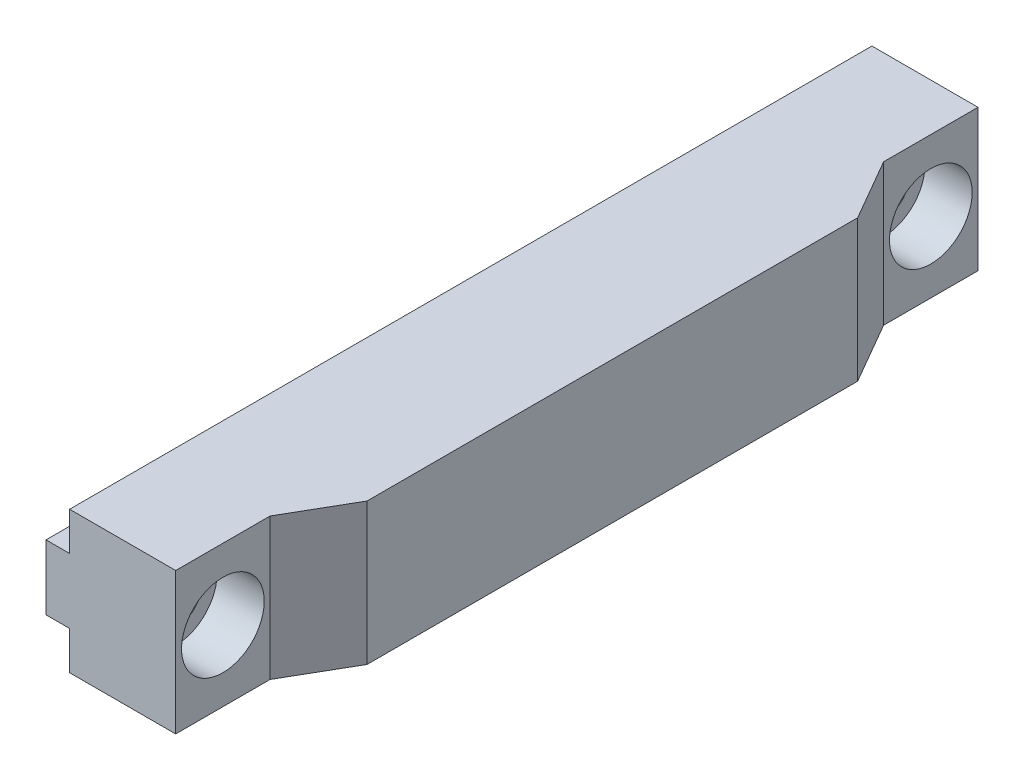
ISO-10303-21;
HEADER;
FILE_DESCRIPTION(('STEP AP214'),'2;1');
FILE_NAME('part.step','',(''),(''),'','','');
FILE_SCHEMA(('AUTOMOTIVE_DESIGN { 1 0 10303 214 1 1 1 1 }'));
ENDSEC;
DATA;
#1=APPLICATION_CONTEXT('core data for automotive mechanical design processes');
#2=APPLICATION_PROTOCOL_DEFINITION('international standard','automotive_design',2000,#1);
#3=PRODUCT_CONTEXT('',#1,'mechanical');
#4=PRODUCT('Part','Part','',(#3));
#5=PRODUCT_RELATED_PRODUCT_CATEGORY('part','',(#4));
#6=PRODUCT_DEFINITION_FORMATION('','',#4);
#7=PRODUCT_DEFINITION_CONTEXT('part definition',#1,'design');
#8=PRODUCT_DEFINITION('design','',#6,#7);
#9=PRODUCT_DEFINITION_SHAPE('','',#8);
#10=(LENGTH_UNIT() NAMED_UNIT(*) SI_UNIT(.MILLI.,.METRE.));
#11=(NAMED_UNIT(*) PLANE_ANGLE_UNIT() SI_UNIT($,.RADIAN.));
#12=(NAMED_UNIT(*) SI_UNIT($,.STERADIAN.) SOLID_ANGLE_UNIT());
#13=UNCERTAINTY_MEASURE_WITH_UNIT(LENGTH_MEASURE(1.E-05),#10,'distance_accuracy_value','');
#14=(GEOMETRIC_REPRESENTATION_CONTEXT(3) GLOBAL_UNCERTAINTY_ASSIGNED_CONTEXT((#13)) GLOBAL_UNIT_ASSIGNED_CONTEXT((#10,
#11,#12)) REPRESENTATION_CONTEXT('',''));
#15=CARTESIAN_POINT('',(0.,0.,0.));
#16=DIRECTION('',(0.,0.,1.));
#17=DIRECTION('',(1.,0.,0.));
#18=AXIS2_PLACEMENT_3D('',#15,#16,#17);
#19=CARTESIAN_POINT('',(-17.4752,0.,-47.625));
#20=DIRECTION('',(1.,0.,0.));
#21=DIRECTION('',(0.,0.,-1.));
#22=AXIS2_PLACEMENT_3D('',#19,#20,#21);
#23=CYLINDRICAL_SURFACE('',#22,3.5687);
#24=CARTESIAN_POINT('',(-12.7,0.,-47.625));
#25=DIRECTION('',(-1.,0.,0.));
#26=DIRECTION('',(0.,0.,1.));
#27=AXIS2_PLACEMENT_3D('',#24,#25,#26);
#28=CIRCLE('',#27,3.5687);
#29=CARTESIAN_POINT('',(-12.7,0.,-44.0563));
#30=VERTEX_POINT('',#29);
#31=EDGE_CURVE('E186',#30,#30,#28,.T.);
#32=ORIENTED_EDGE('',*,*,#31,.T.);
#33=EDGE_LOOP('',(#32));
#34=FACE_BOUND('',#33,.T.);
#35=CARTESIAN_POINT('',(-1.6002,0.,-47.625));
#36=DIRECTION('',(1.,0.,0.));
#37=DIRECTION('',(0.,0.,-1.));
#38=AXIS2_PLACEMENT_3D('',#35,#36,#37);
#39=CIRCLE('',#38,3.5687);
#40=CARTESIAN_POINT('',(-1.6002,0.,-51.1937));
#41=VERTEX_POINT('',#40);
#42=EDGE_CURVE('E45',#41,#41,#39,.F.);
#43=ORIENTED_EDGE('',*,*,#42,.F.);
#44=EDGE_LOOP('',(#43));
#45=FACE_BOUND('',#44,.T.);
#46=ADVANCED_FACE('F41',(#34,#45),#23,.F.);
#47=CARTESIAN_POINT('',(-17.4752,0.,47.625));
#48=DIRECTION('',(1.,0.,0.));
#49=DIRECTION('',(0.,0.,-1.));
#50=AXIS2_PLACEMENT_3D('',#47,#48,#49);
#51=CYLINDRICAL_SURFACE('',#50,3.5687);
#52=CARTESIAN_POINT('',(-12.7,0.,47.625));
#53=DIRECTION('',(-1.,0.,0.));
#54=DIRECTION('',(0.,0.,1.));
#55=AXIS2_PLACEMENT_3D('',#52,#53,#54);
#56=CIRCLE('',#55,3.5687);
#57=CARTESIAN_POINT('',(-12.7,0.,51.1937));
#58=VERTEX_POINT('',#57);
#59=EDGE_CURVE('E189',#58,#58,#56,.T.);
#60=ORIENTED_EDGE('',*,*,#59,.T.);
#61=EDGE_LOOP('',(#60));
#62=FACE_BOUND('',#61,.T.);
#63=CARTESIAN_POINT('',(-1.6002,0.,47.625));
#64=DIRECTION('',(1.,0.,0.));
#65=DIRECTION('',(0.,0.,-1.));
#66=AXIS2_PLACEMENT_3D('',#63,#64,#65);
#67=CIRCLE('',#66,3.5687);
#68=CARTESIAN_POINT('',(-1.6002,0.,44.0563));
#69=VERTEX_POINT('',#68);
#70=EDGE_CURVE('E192',#69,#69,#67,.F.);
#71=ORIENTED_EDGE('',*,*,#70,.F.);
#72=EDGE_LOOP('',(#71));
#73=FACE_BOUND('',#72,.T.);
#74=ADVANCED_FACE('F294',(#62,#73),#51,.F.);
#75=CARTESIAN_POINT('',(-9.525,9.525,53.975));
#76=DIRECTION('',(1.,0.,0.));
#77=DIRECTION('',(0.,0.,-1.));
#78=AXIS2_PLACEMENT_3D('',#75,#76,#77);
#79=PLANE('',#78);
#80=DIRECTION('',(0.,-1.,0.));
#81=VECTOR('',#80,1.);
#82=CARTESIAN_POINT('',(-9.525,9.525,-53.975));
#83=LINE('',#82,#81);
#84=CARTESIAN_POINT('',(-9.525,9.525,-53.975));
#85=VERTEX_POINT('',#84);
#86=CARTESIAN_POINT('',(-9.525,4.3688,-53.975));
#87=VERTEX_POINT('',#86);
#88=EDGE_CURVE('E146',#85,#87,#83,.T.);
#89=ORIENTED_EDGE('',*,*,#88,.T.);
#90=DIRECTION('',(0.,0.,1.));
#91=VECTOR('',#90,1.);
#92=CARTESIAN_POINT('',(-9.525,4.3688,53.975));
#93=LINE('',#92,#91);
#94=CARTESIAN_POINT('',(-9.525,4.3688,53.975));
#95=VERTEX_POINT('',#94);
#96=EDGE_CURVE('E212',#87,#95,#93,.T.);
#97=ORIENTED_EDGE('',*,*,#96,.T.);
#98=DIRECTION('',(0.,-1.,0.));
#99=VECTOR('',#98,1.);
#100=CARTESIAN_POINT('',(-9.525,9.525,53.975));
#101=LINE('',#100,#99);
#102=CARTESIAN_POINT('',(-9.525,9.525,53.975));
#103=VERTEX_POINT('',#102);
#104=EDGE_CURVE('E172',#103,#95,#101,.T.);
#105=ORIENTED_EDGE('',*,*,#104,.F.);
#106=DIRECTION('',(0.,0.,1.));
#107=VECTOR('',#106,1.);
#108=CARTESIAN_POINT('',(-9.525,9.525,53.975));
#109=LINE('',#108,#107);
#110=EDGE_CURVE('E67',#85,#103,#109,.T.);
#111=ORIENTED_EDGE('',*,*,#110,.F.);
#112=EDGE_LOOP('',(#89,#97,#105,#111));
#113=FACE_BOUND('',#112,.T.);
#114=ADVANCED_FACE('F278',(#113),#79,.F.);
#115=CARTESIAN_POINT('',(4.7498,9.525,53.975));
#116=DIRECTION('',(0.,0.,-1.));
#117=DIRECTION('',(-1.,0.,0.));
#118=AXIS2_PLACEMENT_3D('',#115,#116,#117);
#119=PLANE('',#118);
#120=DIRECTION('',(1.,0.,0.));
#121=VECTOR('',#120,1.);
#122=CARTESIAN_POINT('',(4.7498,-9.525,53.975));
#123=LINE('',#122,#121);
#124=CARTESIAN_POINT('',(-9.525,-9.525,53.975));
#125=VERTEX_POINT('',#124);
#126=CARTESIAN_POINT('',(4.7498,-9.525,53.975));
#127=VERTEX_POINT('',#126);
#128=EDGE_CURVE('E155',#125,#127,#123,.T.);
#129=ORIENTED_EDGE('',*,*,#128,.T.);
#130=DIRECTION('',(0.,-1.,0.));
#131=VECTOR('',#130,1.);
#132=CARTESIAN_POINT('',(4.7498,9.525,53.975));
#133=LINE('',#132,#131);
#134=CARTESIAN_POINT('',(4.7498,9.525,53.975));
#135=VERTEX_POINT('',#134);
#136=EDGE_CURVE('E11',#135,#127,#133,.T.);
#137=ORIENTED_EDGE('',*,*,#136,.F.);
#138=DIRECTION('',(1.,0.,0.));
#139=VECTOR('',#138,1.);
#140=CARTESIAN_POINT('',(4.7498,9.525,53.975));
#141=LINE('',#140,#139);
#142=EDGE_CURVE('E171',#103,#135,#141,.T.);
#143=ORIENTED_EDGE('',*,*,#142,.F.);
#144=ORIENTED_EDGE('',*,*,#104,.T.);
#145=DIRECTION('',(-1.,0.,0.));
#146=VECTOR('',#145,1.);
#147=CARTESIAN_POINT('',(-9.525,4.3688,53.975));
#148=LINE('',#147,#146);
#149=CARTESIAN_POINT('',(-12.7,4.3688,53.975));
#150=VERTEX_POINT('',#149);
#151=EDGE_CURVE('E231',#95,#150,#148,.T.);
#152=ORIENTED_EDGE('',*,*,#151,.T.);
#153=DIRECTION('',(0.,-1.,0.));
#154=VECTOR('',#153,1.);
#155=CARTESIAN_POINT('',(-12.7,-4.3688,53.975));
#156=LINE('',#155,#154);
#157=CARTESIAN_POINT('',(-12.7,-4.3688,53.975));
#158=VERTEX_POINT('',#157);
#159=EDGE_CURVE('E223',#150,#158,#156,.T.);
#160=ORIENTED_EDGE('',*,*,#159,.T.);
#161=DIRECTION('',(-1.,0.,0.));
#162=VECTOR('',#161,1.);
#163=CARTESIAN_POINT('',(-9.525,-4.3688,53.975));
#164=LINE('',#163,#162);
#165=CARTESIAN_POINT('',(-9.525,-4.3688,53.975));
#166=VERTEX_POINT('',#165);
#167=EDGE_CURVE('E228',#166,#158,#164,.T.);
#168=ORIENTED_EDGE('',*,*,#167,.F.);
#169=EDGE_CURVE('E101',#166,#125,#101,.T.);
#170=ORIENTED_EDGE('',*,*,#169,.T.);
#171=EDGE_LOOP('',(#129,#137,#143,#144,#152,#160,#168,#170));
#172=FACE_BOUND('',#171,.T.);
#173=ADVANCED_FACE('F43',(#172),#119,.F.);
#174=CARTESIAN_POINT('',(4.7498,9.525,41.275));
#175=DIRECTION('',(-1.,0.,0.));
#176=DIRECTION('',(0.,0.,1.));
#177=AXIS2_PLACEMENT_3D('',#174,#175,#176);
#178=PLANE('',#177);
#179=CARTESIAN_POINT('',(4.7498,0.,47.625));
#180=DIRECTION('',(1.,0.,0.));
#181=DIRECTION('',(0.,0.,-1.));
#182=AXIS2_PLACEMENT_3D('',#179,#180,#181);
#183=CIRCLE('',#182,5.5626);
#184=CARTESIAN_POINT('',(4.7498,0.,42.0624));
#185=VERTEX_POINT('',#184);
#186=EDGE_CURVE('E199',#185,#185,#183,.T.);
#187=ORIENTED_EDGE('',*,*,#186,.F.);
#188=EDGE_LOOP('',(#187));
#189=FACE_BOUND('',#188,.T.);
#190=DIRECTION('',(0.,0.,-1.));
#191=VECTOR('',#190,1.);
#192=CARTESIAN_POINT('',(4.7498,-9.525,41.275));
#193=LINE('',#192,#191);
#194=CARTESIAN_POINT('',(4.7498,-9.525,41.275));
#195=VERTEX_POINT('',#194);
#196=EDGE_CURVE('E157',#127,#195,#193,.T.);
#197=ORIENTED_EDGE('',*,*,#196,.T.);
#198=DIRECTION('',(0.,-1.,0.));
#199=VECTOR('',#198,1.);
#200=CARTESIAN_POINT('',(4.7498,9.525,41.275));
#201=LINE('',#200,#199);
#202=CARTESIAN_POINT('',(4.7498,9.525,41.275));
#203=VERTEX_POINT('',#202);
#204=EDGE_CURVE('E50',#203,#195,#201,.T.);
#205=ORIENTED_EDGE('',*,*,#204,.F.);
#206=DIRECTION('',(0.,0.,-1.));
#207=VECTOR('',#206,1.);
#208=CARTESIAN_POINT('',(4.7498,9.525,41.275));
#209=LINE('',#208,#207);
#210=EDGE_CURVE('E109',#135,#203,#209,.T.);
#211=ORIENTED_EDGE('',*,*,#210,.F.);
#212=ORIENTED_EDGE('',*,*,#136,.T.);
#213=EDGE_LOOP('',(#197,#205,#211,#212));
#214=FACE_BOUND('',#213,.T.);
#215=ADVANCED_FACE('F281',(#189,#214),#178,.F.);
#216=CARTESIAN_POINT('',(9.525,9.525,33.0041109836971));
#217=DIRECTION('',(-0.866025403784439,0.,-0.5));
#218=DIRECTION('',(-0.5,0.,0.866025403784439));
#219=AXIS2_PLACEMENT_3D('',#216,#217,#218);
#220=PLANE('',#219);
#221=DIRECTION('',(0.5,0.,-0.866025403784439));
#222=VECTOR('',#221,1.);
#223=CARTESIAN_POINT('',(9.525,-9.525,33.0041109836971));
#224=LINE('',#223,#222);
#225=CARTESIAN_POINT('',(9.525,-9.525,33.0041109836971));
#226=VERTEX_POINT('',#225);
#227=EDGE_CURVE('E160',#195,#226,#224,.T.);
#228=ORIENTED_EDGE('',*,*,#227,.T.);
#229=DIRECTION('',(0.,-1.,0.));
#230=VECTOR('',#229,1.);
#231=CARTESIAN_POINT('',(9.525,9.525,33.0041109836971));
#232=LINE('',#231,#230);
#233=CARTESIAN_POINT('',(9.525,9.525,33.0041109836971));
#234=VERTEX_POINT('',#233);
#235=EDGE_CURVE('E181',#234,#226,#232,.T.);
#236=ORIENTED_EDGE('',*,*,#235,.F.);
#237=DIRECTION('',(0.5,0.,-0.866025403784439));
#238=VECTOR('',#237,1.);
#239=CARTESIAN_POINT('',(9.525,9.525,33.0041109836971));
#240=LINE('',#239,#238);
#241=EDGE_CURVE('E238',#203,#234,#240,.T.);
#242=ORIENTED_EDGE('',*,*,#241,.F.);
#243=ORIENTED_EDGE('',*,*,#204,.T.);
#244=EDGE_LOOP('',(#228,#236,#242,#243));
#245=FACE_BOUND('',#244,.T.);
#246=ADVANCED_FACE('F284',(#245),#220,.F.);
#247=CARTESIAN_POINT('',(9.525,9.525,-33.0041109836971));
#248=DIRECTION('',(-1.,0.,0.));
#249=DIRECTION('',(0.,0.,1.));
#250=AXIS2_PLACEMENT_3D('',#247,#248,#249);
#251=PLANE('',#250);
#252=DIRECTION('',(0.,0.,-1.));
#253=VECTOR('',#252,1.);
#254=CARTESIAN_POINT('',(9.525,-9.525,-33.0041109836971));
#255=LINE('',#254,#253);
#256=CARTESIAN_POINT('',(9.525,-9.525,-33.0041109836971));
#257=VERTEX_POINT('',#256);
#258=EDGE_CURVE('E162',#226,#257,#255,.T.);
#259=ORIENTED_EDGE('',*,*,#258,.T.);
#260=DIRECTION('',(0.,-1.,0.));
#261=VECTOR('',#260,1.);
#262=CARTESIAN_POINT('',(9.525,9.525,-33.0041109836971));
#263=LINE('',#262,#261);
#264=CARTESIAN_POINT('',(9.525,9.525,-33.0041109836971));
#265=VERTEX_POINT('',#264);
#266=EDGE_CURVE('E178',#265,#257,#263,.T.);
#267=ORIENTED_EDGE('',*,*,#266,.F.);
#268=DIRECTION('',(0.,0.,-1.));
#269=VECTOR('',#268,1.);
#270=CARTESIAN_POINT('',(9.525,9.525,-33.0041109836971));
#271=LINE('',#270,#269);
#272=EDGE_CURVE('E240',#234,#265,#271,.T.);
#273=ORIENTED_EDGE('',*,*,#272,.F.);
#274=ORIENTED_EDGE('',*,*,#235,.T.);
#275=EDGE_LOOP('',(#259,#267,#273,#274));
#276=FACE_BOUND('',#275,.T.);
#277=ADVANCED_FACE('F246',(#276),#251,.F.);
#278=CARTESIAN_POINT('',(4.7498,9.525,-41.275));
#279=DIRECTION('',(-0.866025403784439,0.,0.5));
#280=DIRECTION('',(0.5,0.,0.866025403784439));
#281=AXIS2_PLACEMENT_3D('',#278,#279,#280);
#282=PLANE('',#281);
#283=DIRECTION('',(-0.5,0.,-0.866025403784439));
#284=VECTOR('',#283,1.);
#285=CARTESIAN_POINT('',(4.7498,-9.525,-41.275));
#286=LINE('',#285,#284);
#287=CARTESIAN_POINT('',(4.7498,-9.525,-41.275));
#288=VERTEX_POINT('',#287);
#289=EDGE_CURVE('E164',#257,#288,#286,.T.);
#290=ORIENTED_EDGE('',*,*,#289,.T.);
#291=DIRECTION('',(0.,-1.,0.));
#292=VECTOR('',#291,1.);
#293=CARTESIAN_POINT('',(4.7498,9.525,-41.275));
#294=LINE('',#293,#292);
#295=CARTESIAN_POINT('',(4.7498,9.525,-41.275));
#296=VERTEX_POINT('',#295);
#297=EDGE_CURVE('E145',#296,#288,#294,.T.);
#298=ORIENTED_EDGE('',*,*,#297,.F.);
#299=DIRECTION('',(-0.5,0.,-0.866025403784439));
#300=VECTOR('',#299,1.);
#301=CARTESIAN_POINT('',(4.7498,9.525,-41.275));
#302=LINE('',#301,#300);
#303=EDGE_CURVE('E132',#265,#296,#302,.T.);
#304=ORIENTED_EDGE('',*,*,#303,.F.);
#305=ORIENTED_EDGE('',*,*,#266,.T.);
#306=EDGE_LOOP('',(#290,#298,#304,#305));
#307=FACE_BOUND('',#306,.T.);
#308=ADVANCED_FACE('F250',(#307),#282,.F.);
#309=CARTESIAN_POINT('',(4.7498,9.525,-53.975));
#310=DIRECTION('',(-1.,0.,0.));
#311=DIRECTION('',(0.,0.,1.));
#312=AXIS2_PLACEMENT_3D('',#309,#310,#311);
#313=PLANE('',#312);
#314=CARTESIAN_POINT('',(4.7498,0.,-47.625));
#315=DIRECTION('',(1.,0.,0.));
#316=DIRECTION('',(0.,0.,-1.));
#317=AXIS2_PLACEMENT_3D('',#314,#315,#316);
#318=CIRCLE('',#317,5.5626);
#319=CARTESIAN_POINT('',(4.7498,0.,-53.1876));
#320=VERTEX_POINT('',#319);
#321=EDGE_CURVE('E204',#320,#320,#318,.T.);
#322=ORIENTED_EDGE('',*,*,#321,.F.);
#323=EDGE_LOOP('',(#322));
#324=FACE_BOUND('',#323,.T.);
#325=DIRECTION('',(0.,0.,-1.));
#326=VECTOR('',#325,1.);
#327=CARTESIAN_POINT('',(4.7498,-9.525,-53.975));
#328=LINE('',#327,#326);
#329=CARTESIAN_POINT('',(4.7498,-9.525,-53.975));
#330=VERTEX_POINT('',#329);
#331=EDGE_CURVE('E141',#288,#330,#328,.T.);
#332=ORIENTED_EDGE('',*,*,#331,.T.);
#333=DIRECTION('',(0.,-1.,0.));
#334=VECTOR('',#333,1.);
#335=CARTESIAN_POINT('',(4.7498,9.525,-53.975));
#336=LINE('',#335,#334);
#337=CARTESIAN_POINT('',(4.7498,9.525,-53.975));
#338=VERTEX_POINT('',#337);
#339=EDGE_CURVE('E138',#338,#330,#336,.T.);
#340=ORIENTED_EDGE('',*,*,#339,.F.);
#341=DIRECTION('',(0.,0.,-1.));
#342=VECTOR('',#341,1.);
#343=CARTESIAN_POINT('',(4.7498,9.525,-53.975));
#344=LINE('',#343,#342);
#345=EDGE_CURVE('E125',#296,#338,#344,.T.);
#346=ORIENTED_EDGE('',*,*,#345,.F.);
#347=ORIENTED_EDGE('',*,*,#297,.T.);
#348=EDGE_LOOP('',(#332,#340,#346,#347));
#349=FACE_BOUND('',#348,.T.);
#350=ADVANCED_FACE('F139',(#324,#349),#313,.F.);
#351=CARTESIAN_POINT('',(-9.525,9.525,-53.975));
#352=DIRECTION('',(0.,0.,1.));
#353=DIRECTION('',(1.,0.,0.));
#354=AXIS2_PLACEMENT_3D('',#351,#352,#353);
#355=PLANE('',#354);
#356=DIRECTION('',(-1.,0.,0.));
#357=VECTOR('',#356,1.);
#358=CARTESIAN_POINT('',(-9.525,-9.525,-53.975));
#359=LINE('',#358,#357);
#360=CARTESIAN_POINT('',(-9.525,-9.525,-53.975));
#361=VERTEX_POINT('',#360);
#362=EDGE_CURVE('E167',#330,#361,#359,.T.);
#363=ORIENTED_EDGE('',*,*,#362,.T.);
#364=CARTESIAN_POINT('',(-9.525,-4.3688,-53.975));
#365=VERTEX_POINT('',#364);
#366=EDGE_CURVE('E175',#365,#361,#83,.T.);
#367=ORIENTED_EDGE('',*,*,#366,.F.);
#368=DIRECTION('',(-1.,0.,0.));
#369=VECTOR('',#368,1.);
#370=CARTESIAN_POINT('',(-9.525,-4.3688,-53.975));
#371=LINE('',#370,#369);
#372=CARTESIAN_POINT('',(-12.7,-4.3688,-53.975));
#373=VERTEX_POINT('',#372);
#374=EDGE_CURVE('E58',#365,#373,#371,.T.);
#375=ORIENTED_EDGE('',*,*,#374,.T.);
#376=DIRECTION('',(0.,1.,0.));
#377=VECTOR('',#376,1.);
#378=CARTESIAN_POINT('',(-12.7,-4.3688,-53.975));
#379=LINE('',#378,#377);
#380=CARTESIAN_POINT('',(-12.7,4.3688,-53.975));
#381=VERTEX_POINT('',#380);
#382=EDGE_CURVE('E191',#373,#381,#379,.T.);
#383=ORIENTED_EDGE('',*,*,#382,.T.);
#384=DIRECTION('',(-1.,0.,0.));
#385=VECTOR('',#384,1.);
#386=CARTESIAN_POINT('',(-9.525,4.3688,-53.975));
#387=LINE('',#386,#385);
#388=EDGE_CURVE('E158',#87,#381,#387,.T.);
#389=ORIENTED_EDGE('',*,*,#388,.F.);
#390=ORIENTED_EDGE('',*,*,#88,.F.);
#391=DIRECTION('',(-1.,0.,0.));
#392=VECTOR('',#391,1.);
#393=CARTESIAN_POINT('',(-9.525,9.525,-53.975));
#394=LINE('',#393,#392);
#395=EDGE_CURVE('E129',#338,#85,#394,.T.);
#396=ORIENTED_EDGE('',*,*,#395,.F.);
#397=ORIENTED_EDGE('',*,*,#339,.T.);
#398=EDGE_LOOP('',(#363,#367,#375,#383,#389,#390,#396,#397));
#399=FACE_BOUND('',#398,.T.);
#400=ADVANCED_FACE('F148',(#399),#355,.F.);
#401=ORIENTED_EDGE('',*,*,#169,.F.);
#402=DIRECTION('',(0.,0.,-1.));
#403=VECTOR('',#402,1.);
#404=CARTESIAN_POINT('',(-9.525,-4.3688,53.975));
#405=LINE('',#404,#403);
#406=EDGE_CURVE('E215',#166,#365,#405,.T.);
#407=ORIENTED_EDGE('',*,*,#406,.T.);
#408=ORIENTED_EDGE('',*,*,#366,.T.);
#409=DIRECTION('',(0.,0.,1.));
#410=VECTOR('',#409,1.);
#411=CARTESIAN_POINT('',(-9.525,-9.525,53.975));
#412=LINE('',#411,#410);
#413=EDGE_CURVE('E169',#361,#125,#412,.T.);
#414=ORIENTED_EDGE('',*,*,#413,.T.);
#415=EDGE_LOOP('',(#401,#407,#408,#414));
#416=FACE_BOUND('',#415,.T.);
#417=ADVANCED_FACE('F258',(#416),#79,.F.);
#418=CARTESIAN_POINT('',(0.,9.525,0.));
#419=DIRECTION('',(0.,-1.,0.));
#420=DIRECTION('',(0.,0.,-1.));
#421=AXIS2_PLACEMENT_3D('',#418,#419,#420);
#422=PLANE('',#421);
#423=ORIENTED_EDGE('',*,*,#142,.T.);
#424=ORIENTED_EDGE('',*,*,#210,.T.);
#425=ORIENTED_EDGE('',*,*,#241,.T.);
#426=ORIENTED_EDGE('',*,*,#272,.T.);
#427=ORIENTED_EDGE('',*,*,#303,.T.);
#428=ORIENTED_EDGE('',*,*,#345,.T.);
#429=ORIENTED_EDGE('',*,*,#395,.T.);
#430=ORIENTED_EDGE('',*,*,#110,.T.);
#431=EDGE_LOOP('',(#423,#424,#425,#426,#427,#428,#429,#430));
#432=FACE_BOUND('',#431,.T.);
#433=ADVANCED_FACE('F127',(#432),#422,.F.);
#434=CARTESIAN_POINT('',(0.,-9.525,0.));
#435=DIRECTION('',(0.,-1.,0.));
#436=DIRECTION('',(0.,0.,-1.));
#437=AXIS2_PLACEMENT_3D('',#434,#435,#436);
#438=PLANE('',#437);
#439=ORIENTED_EDGE('',*,*,#128,.F.);
#440=ORIENTED_EDGE('',*,*,#413,.F.);
#441=ORIENTED_EDGE('',*,*,#362,.F.);
#442=ORIENTED_EDGE('',*,*,#331,.F.);
#443=ORIENTED_EDGE('',*,*,#289,.F.);
#444=ORIENTED_EDGE('',*,*,#258,.F.);
#445=ORIENTED_EDGE('',*,*,#227,.F.);
#446=ORIENTED_EDGE('',*,*,#196,.F.);
#447=EDGE_LOOP('',(#439,#440,#441,#442,#443,#444,#445,#446));
#448=FACE_BOUND('',#447,.T.);
#449=ADVANCED_FACE('F253',(#448),#438,.T.);
#450=CARTESIAN_POINT('',(-9.525,4.3688,53.975));
#451=DIRECTION('',(0.,-1.,0.));
#452=DIRECTION('',(0.,0.,-1.));
#453=AXIS2_PLACEMENT_3D('',#450,#451,#452);
#454=PLANE('',#453);
#455=DIRECTION('',(0.,0.,1.));
#456=VECTOR('',#455,1.);
#457=CARTESIAN_POINT('',(-12.7,4.3688,53.975));
#458=LINE('',#457,#456);
#459=EDGE_CURVE('E220',#381,#150,#458,.T.);
#460=ORIENTED_EDGE('',*,*,#459,.T.);
#461=ORIENTED_EDGE('',*,*,#151,.F.);
#462=ORIENTED_EDGE('',*,*,#96,.F.);
#463=ORIENTED_EDGE('',*,*,#388,.T.);
#464=EDGE_LOOP('',(#460,#461,#462,#463));
#465=FACE_BOUND('',#464,.T.);
#466=ADVANCED_FACE('F276',(#465),#454,.F.);
#467=CARTESIAN_POINT('',(-9.525,-4.3688,53.975));
#468=DIRECTION('',(0.,1.,0.));
#469=DIRECTION('',(0.,0.,1.));
#470=AXIS2_PLACEMENT_3D('',#467,#468,#469);
#471=PLANE('',#470);
#472=DIRECTION('',(0.,0.,-1.));
#473=VECTOR('',#472,1.);
#474=CARTESIAN_POINT('',(-12.7,-4.3688,53.975));
#475=LINE('',#474,#473);
#476=EDGE_CURVE('E216',#158,#373,#475,.T.);
#477=ORIENTED_EDGE('',*,*,#476,.T.);
#478=ORIENTED_EDGE('',*,*,#374,.F.);
#479=ORIENTED_EDGE('',*,*,#406,.F.);
#480=ORIENTED_EDGE('',*,*,#167,.T.);
#481=EDGE_LOOP('',(#477,#478,#479,#480));
#482=FACE_BOUND('',#481,.T.);
#483=ADVANCED_FACE('F259',(#482),#471,.F.);
#484=CARTESIAN_POINT('',(-12.7,0.,0.));
#485=DIRECTION('',(-1.,0.,0.));
#486=DIRECTION('',(0.,0.,1.));
#487=AXIS2_PLACEMENT_3D('',#484,#485,#486);
#488=PLANE('',#487);
#489=ORIENTED_EDGE('',*,*,#59,.F.);
#490=EDGE_LOOP('',(#489));
#491=FACE_BOUND('',#490,.T.);
#492=ORIENTED_EDGE('',*,*,#31,.F.);
#493=EDGE_LOOP('',(#492));
#494=FACE_BOUND('',#493,.T.);
#495=ORIENTED_EDGE('',*,*,#382,.F.);
#496=ORIENTED_EDGE('',*,*,#476,.F.);
#497=ORIENTED_EDGE('',*,*,#159,.F.);
#498=ORIENTED_EDGE('',*,*,#459,.F.);
#499=EDGE_LOOP('',(#495,#496,#497,#498));
#500=FACE_BOUND('',#499,.T.);
#501=ADVANCED_FACE('F306',(#491,#494,#500),#488,.T.);
#502=CARTESIAN_POINT('',(-1.6002,0.,47.625));
#503=DIRECTION('',(1.,0.,0.));
#504=DIRECTION('',(0.,0.,-1.));
#505=AXIS2_PLACEMENT_3D('',#502,#503,#504);
#506=PLANE('',#505);
#507=CARTESIAN_POINT('',(-1.6002,0.,47.625));
#508=DIRECTION('',(1.,0.,0.));
#509=DIRECTION('',(0.,0.,-1.));
#510=AXIS2_PLACEMENT_3D('',#507,#508,#509);
#511=CIRCLE('',#510,5.5626);
#512=CARTESIAN_POINT('',(-1.6002,0.,42.0624));
#513=VERTEX_POINT('',#512);
#514=EDGE_CURVE('E194',#513,#513,#511,.T.);
#515=ORIENTED_EDGE('',*,*,#514,.T.);
#516=EDGE_LOOP('',(#515));
#517=FACE_BOUND('',#516,.T.);
#518=ORIENTED_EDGE('',*,*,#70,.T.);
#519=EDGE_LOOP('',(#518));
#520=FACE_BOUND('',#519,.T.);
#521=ADVANCED_FACE('F308',(#517,#520),#506,.T.);
#522=CARTESIAN_POINT('',(-1.6002,0.,47.625));
#523=DIRECTION('',(1.,0.,0.));
#524=DIRECTION('',(0.,0.,-1.));
#525=AXIS2_PLACEMENT_3D('',#522,#523,#524);
#526=CYLINDRICAL_SURFACE('',#525,5.5626);
#527=ORIENTED_EDGE('',*,*,#514,.F.);
#528=EDGE_LOOP('',(#527));
#529=FACE_BOUND('',#528,.T.);
#530=ORIENTED_EDGE('',*,*,#186,.T.);
#531=EDGE_LOOP('',(#530));
#532=FACE_BOUND('',#531,.T.);
#533=ADVANCED_FACE('F396',(#529,#532),#526,.F.);
#534=CARTESIAN_POINT('',(-1.6002,0.,-47.625));
#535=DIRECTION('',(1.,0.,0.));
#536=DIRECTION('',(0.,0.,-1.));
#537=AXIS2_PLACEMENT_3D('',#534,#535,#536);
#538=PLANE('',#537);
#539=CARTESIAN_POINT('',(-1.6002,0.,-47.625));
#540=DIRECTION('',(1.,0.,0.));
#541=DIRECTION('',(0.,0.,-1.));
#542=AXIS2_PLACEMENT_3D('',#539,#540,#541);
#543=CIRCLE('',#542,5.5626);
#544=CARTESIAN_POINT('',(-1.6002,0.,-53.1876));
#545=VERTEX_POINT('',#544);
#546=EDGE_CURVE('E209',#545,#545,#543,.T.);
#547=ORIENTED_EDGE('',*,*,#546,.T.);
#548=EDGE_LOOP('',(#547));
#549=FACE_BOUND('',#548,.T.);
#550=ORIENTED_EDGE('',*,*,#42,.T.);
#551=EDGE_LOOP('',(#550));
#552=FACE_BOUND('',#551,.T.);
#553=ADVANCED_FACE('F405',(#549,#552),#538,.T.);
#554=CARTESIAN_POINT('',(-1.6002,0.,-47.625));
#555=DIRECTION('',(1.,0.,0.));
#556=DIRECTION('',(0.,0.,-1.));
#557=AXIS2_PLACEMENT_3D('',#554,#555,#556);
#558=CYLINDRICAL_SURFACE('',#557,5.5626);
#559=ORIENTED_EDGE('',*,*,#546,.F.);
#560=EDGE_LOOP('',(#559));
#561=FACE_BOUND('',#560,.T.);
#562=ORIENTED_EDGE('',*,*,#321,.T.);
#563=EDGE_LOOP('',(#562));
#564=FACE_BOUND('',#563,.T.);
#565=ADVANCED_FACE('F415',(#561,#564),#558,.F.);
#566=CLOSED_SHELL('',(#46,#74,#114,#173,#215,#246,#277,#308,#350,#400,#417,#433,#449,#466,#483,
#501,#521,#533,#553,#565));
#567=MANIFOLD_SOLID_BREP('B2',#566);
#568=ADVANCED_BREP_SHAPE_REPRESENTATION('',(#18,#567),#14);
#569=SHAPE_DEFINITION_REPRESENTATION(#9,#568);
ENDSEC;
END-ISO-10303-21;
